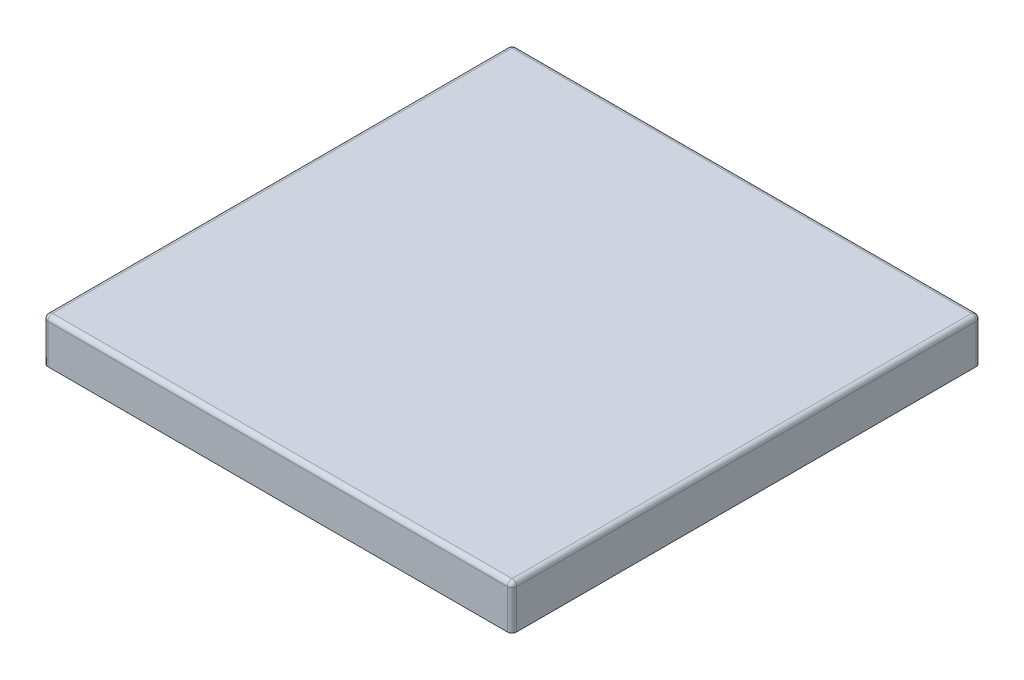
ISO-10303-21;
HEADER;
FILE_DESCRIPTION(('STEP AP214'),'2;1');
FILE_NAME('part.step','',(''),(''),'','','');
FILE_SCHEMA(('AUTOMOTIVE_DESIGN { 1 0 10303 214 1 1 1 1 }'));
ENDSEC;
DATA;
#1=APPLICATION_CONTEXT('core data for automotive mechanical design processes');
#2=APPLICATION_PROTOCOL_DEFINITION('international standard','automotive_design',2000,#1);
#3=PRODUCT_CONTEXT('',#1,'mechanical');
#4=PRODUCT('Part','Part','',(#3));
#5=PRODUCT_RELATED_PRODUCT_CATEGORY('part','',(#4));
#6=PRODUCT_DEFINITION_FORMATION('','',#4);
#7=PRODUCT_DEFINITION_CONTEXT('part definition',#1,'design');
#8=PRODUCT_DEFINITION('design','',#6,#7);
#9=PRODUCT_DEFINITION_SHAPE('','',#8);
#10=(LENGTH_UNIT() NAMED_UNIT(*) SI_UNIT(.MILLI.,.METRE.));
#11=(NAMED_UNIT(*) PLANE_ANGLE_UNIT() SI_UNIT($,.RADIAN.));
#12=(NAMED_UNIT(*) SI_UNIT($,.STERADIAN.) SOLID_ANGLE_UNIT());
#13=UNCERTAINTY_MEASURE_WITH_UNIT(LENGTH_MEASURE(1.E-05),#10,'distance_accuracy_value','');
#14=(GEOMETRIC_REPRESENTATION_CONTEXT(3) GLOBAL_UNCERTAINTY_ASSIGNED_CONTEXT((#13)) GLOBAL_UNIT_ASSIGNED_CONTEXT((#10,
#11,#12)) REPRESENTATION_CONTEXT('',''));
#15=CARTESIAN_POINT('',(0.,0.,0.));
#16=DIRECTION('',(0.,0.,1.));
#17=DIRECTION('',(1.,0.,0.));
#18=AXIS2_PLACEMENT_3D('',#15,#16,#17);
#19=CARTESIAN_POINT('',(-50.8,9.525,50.8));
#20=DIRECTION('',(1.,0.,0.));
#21=DIRECTION('',(0.,0.,-1.));
#22=AXIS2_PLACEMENT_3D('',#19,#20,#21);
#23=PLANE('',#22);
#24=DIRECTION('',(0.,0.,1.));
#25=VECTOR('',#24,1.);
#26=CARTESIAN_POINT('',(-50.8,0.,50.8));
#27=LINE('',#26,#25);
#28=CARTESIAN_POINT('',(-50.8,0.,-49.8));
#29=VERTEX_POINT('',#28);
#30=CARTESIAN_POINT('',(-50.8,0.,49.8));
#31=VERTEX_POINT('',#30);
#32=EDGE_CURVE('E223',#29,#31,#27,.T.);
#33=ORIENTED_EDGE('',*,*,#32,.T.);
#34=DIRECTION('',(0.,-1.,0.));
#35=VECTOR('',#34,1.);
#36=CARTESIAN_POINT('',(-50.8,9.525,49.8));
#37=LINE('',#36,#35);
#38=CARTESIAN_POINT('',(-50.8,8.525,49.8));
#39=VERTEX_POINT('',#38);
#40=EDGE_CURVE('E259',#31,#39,#37,.F.);
#41=ORIENTED_EDGE('',*,*,#40,.T.);
#42=DIRECTION('',(0.,0.,1.));
#43=VECTOR('',#42,1.);
#44=CARTESIAN_POINT('',(-50.8,8.525,-50.8));
#45=LINE('',#44,#43);
#46=CARTESIAN_POINT('',(-50.8,8.525,-49.8));
#47=VERTEX_POINT('',#46);
#48=EDGE_CURVE('E257',#39,#47,#45,.F.);
#49=ORIENTED_EDGE('',*,*,#48,.T.);
#50=DIRECTION('',(0.,-1.,0.));
#51=VECTOR('',#50,1.);
#52=CARTESIAN_POINT('',(-50.8,9.525,-49.8));
#53=LINE('',#52,#51);
#54=EDGE_CURVE('E255',#47,#29,#53,.T.);
#55=ORIENTED_EDGE('',*,*,#54,.T.);
#56=EDGE_LOOP('',(#33,#41,#49,#55));
#57=FACE_BOUND('',#56,.T.);
#58=ADVANCED_FACE('F49',(#57),#23,.F.);
#59=CARTESIAN_POINT('',(50.8,9.525,50.8));
#60=DIRECTION('',(0.,0.,-1.));
#61=DIRECTION('',(-1.,0.,0.));
#62=AXIS2_PLACEMENT_3D('',#59,#60,#61);
#63=PLANE('',#62);
#64=DIRECTION('',(1.,0.,0.));
#65=VECTOR('',#64,1.);
#66=CARTESIAN_POINT('',(50.8,0.,50.8));
#67=LINE('',#66,#65);
#68=CARTESIAN_POINT('',(-49.8,0.,50.8));
#69=VERTEX_POINT('',#68);
#70=CARTESIAN_POINT('',(49.8,0.,50.8));
#71=VERTEX_POINT('',#70);
#72=EDGE_CURVE('E226',#69,#71,#67,.T.);
#73=ORIENTED_EDGE('',*,*,#72,.T.);
#74=DIRECTION('',(0.,-1.,0.));
#75=VECTOR('',#74,1.);
#76=CARTESIAN_POINT('',(49.8,9.525,50.8));
#77=LINE('',#76,#75);
#78=CARTESIAN_POINT('',(49.8,8.525,50.8));
#79=VERTEX_POINT('',#78);
#80=EDGE_CURVE('E253',#71,#79,#77,.F.);
#81=ORIENTED_EDGE('',*,*,#80,.T.);
#82=DIRECTION('',(1.,0.,0.));
#83=VECTOR('',#82,1.);
#84=CARTESIAN_POINT('',(-50.8,8.525,50.8));
#85=LINE('',#84,#83);
#86=CARTESIAN_POINT('',(-49.8,8.525,50.8));
#87=VERTEX_POINT('',#86);
#88=EDGE_CURVE('E249',#79,#87,#85,.F.);
#89=ORIENTED_EDGE('',*,*,#88,.T.);
#90=DIRECTION('',(0.,-1.,0.));
#91=VECTOR('',#90,1.);
#92=CARTESIAN_POINT('',(-49.8,9.525,50.8));
#93=LINE('',#92,#91);
#94=EDGE_CURVE('E251',#87,#69,#93,.T.);
#95=ORIENTED_EDGE('',*,*,#94,.T.);
#96=EDGE_LOOP('',(#73,#81,#89,#95));
#97=FACE_BOUND('',#96,.T.);
#98=ADVANCED_FACE('F357',(#97),#63,.F.);
#99=CARTESIAN_POINT('',(50.8,9.525,50.8));
#100=DIRECTION('',(-1.,0.,0.));
#101=DIRECTION('',(0.,0.,1.));
#102=AXIS2_PLACEMENT_3D('',#99,#100,#101);
#103=PLANE('',#102);
#104=DIRECTION('',(0.,0.,-1.));
#105=VECTOR('',#104,1.);
#106=CARTESIAN_POINT('',(50.8,8.525,50.8));
#107=LINE('',#106,#105);
#108=CARTESIAN_POINT('',(50.8,8.525,-49.8));
#109=VERTEX_POINT('',#108);
#110=CARTESIAN_POINT('',(50.8,8.525,49.8));
#111=VERTEX_POINT('',#110);
#112=EDGE_CURVE('E234',#109,#111,#107,.F.);
#113=ORIENTED_EDGE('',*,*,#112,.T.);
#114=DIRECTION('',(0.,-1.,0.));
#115=VECTOR('',#114,1.);
#116=CARTESIAN_POINT('',(50.8,9.525,49.8));
#117=LINE('',#116,#115);
#118=CARTESIAN_POINT('',(50.8,0.,49.8));
#119=VERTEX_POINT('',#118);
#120=EDGE_CURVE('E238',#111,#119,#117,.T.);
#121=ORIENTED_EDGE('',*,*,#120,.T.);
#122=DIRECTION('',(0.,0.,-1.));
#123=VECTOR('',#122,1.);
#124=CARTESIAN_POINT('',(50.8,0.,50.8));
#125=LINE('',#124,#123);
#126=CARTESIAN_POINT('',(50.8,0.,-49.8));
#127=VERTEX_POINT('',#126);
#128=EDGE_CURVE('E229',#119,#127,#125,.T.);
#129=ORIENTED_EDGE('',*,*,#128,.T.);
#130=DIRECTION('',(0.,-1.,0.));
#131=VECTOR('',#130,1.);
#132=CARTESIAN_POINT('',(50.8,9.525,-49.8));
#133=LINE('',#132,#131);
#134=EDGE_CURVE('E236',#127,#109,#133,.F.);
#135=ORIENTED_EDGE('',*,*,#134,.T.);
#136=EDGE_LOOP('',(#113,#121,#129,#135));
#137=FACE_BOUND('',#136,.T.);
#138=ADVANCED_FACE('F349',(#137),#103,.F.);
#139=CARTESIAN_POINT('',(50.8,9.525,-50.8));
#140=DIRECTION('',(0.,0.,1.));
#141=DIRECTION('',(1.,0.,0.));
#142=AXIS2_PLACEMENT_3D('',#139,#140,#141);
#143=PLANE('',#142);
#144=DIRECTION('',(-1.,0.,0.));
#145=VECTOR('',#144,1.);
#146=CARTESIAN_POINT('',(50.8,0.,-50.8));
#147=LINE('',#146,#145);
#148=CARTESIAN_POINT('',(49.8,0.,-50.8));
#149=VERTEX_POINT('',#148);
#150=CARTESIAN_POINT('',(-49.8,0.,-50.8));
#151=VERTEX_POINT('',#150);
#152=EDGE_CURVE('E232',#149,#151,#147,.T.);
#153=ORIENTED_EDGE('',*,*,#152,.T.);
#154=DIRECTION('',(0.,-1.,0.));
#155=VECTOR('',#154,1.);
#156=CARTESIAN_POINT('',(-49.8,9.525,-50.8));
#157=LINE('',#156,#155);
#158=CARTESIAN_POINT('',(-49.8,8.525,-50.8));
#159=VERTEX_POINT('',#158);
#160=EDGE_CURVE('E13',#151,#159,#157,.F.);
#161=ORIENTED_EDGE('',*,*,#160,.T.);
#162=DIRECTION('',(-1.,0.,0.));
#163=VECTOR('',#162,1.);
#164=CARTESIAN_POINT('',(50.8,8.525,-50.8));
#165=LINE('',#164,#163);
#166=CARTESIAN_POINT('',(49.8,8.525,-50.8));
#167=VERTEX_POINT('',#166);
#168=EDGE_CURVE('E65',#159,#167,#165,.F.);
#169=ORIENTED_EDGE('',*,*,#168,.T.);
#170=DIRECTION('',(0.,-1.,0.));
#171=VECTOR('',#170,1.);
#172=CARTESIAN_POINT('',(49.8,9.525,-50.8));
#173=LINE('',#172,#171);
#174=EDGE_CURVE('E58',#167,#149,#173,.T.);
#175=ORIENTED_EDGE('',*,*,#174,.T.);
#176=EDGE_LOOP('',(#153,#161,#169,#175));
#177=FACE_BOUND('',#176,.T.);
#178=ADVANCED_FACE('F347',(#177),#143,.F.);
#179=CARTESIAN_POINT('',(0.,9.525,0.));
#180=DIRECTION('',(0.,1.,0.));
#181=DIRECTION('',(0.,0.,1.));
#182=AXIS2_PLACEMENT_3D('',#179,#180,#181);
#183=PLANE('',#182);
#184=DIRECTION('',(-1.,0.,0.));
#185=VECTOR('',#184,1.);
#186=CARTESIAN_POINT('',(-50.8,9.525,-49.8));
#187=LINE('',#186,#185);
#188=CARTESIAN_POINT('',(49.8,9.525,-49.8));
#189=VERTEX_POINT('',#188);
#190=CARTESIAN_POINT('',(-49.8,9.525,-49.8));
#191=VERTEX_POINT('',#190);
#192=EDGE_CURVE('E263',#189,#191,#187,.T.);
#193=ORIENTED_EDGE('',*,*,#192,.T.);
#194=DIRECTION('',(0.,0.,1.));
#195=VECTOR('',#194,1.);
#196=CARTESIAN_POINT('',(-49.8,9.525,50.8));
#197=LINE('',#196,#195);
#198=CARTESIAN_POINT('',(-49.8,9.525,49.8));
#199=VERTEX_POINT('',#198);
#200=EDGE_CURVE('E267',#191,#199,#197,.T.);
#201=ORIENTED_EDGE('',*,*,#200,.T.);
#202=DIRECTION('',(1.,0.,0.));
#203=VECTOR('',#202,1.);
#204=CARTESIAN_POINT('',(50.8,9.525,49.8));
#205=LINE('',#204,#203);
#206=CARTESIAN_POINT('',(49.8,9.525,49.8));
#207=VERTEX_POINT('',#206);
#208=EDGE_CURVE('E265',#199,#207,#205,.T.);
#209=ORIENTED_EDGE('',*,*,#208,.T.);
#210=DIRECTION('',(0.,0.,-1.));
#211=VECTOR('',#210,1.);
#212=CARTESIAN_POINT('',(49.8,9.525,-50.8));
#213=LINE('',#212,#211);
#214=EDGE_CURVE('E261',#207,#189,#213,.T.);
#215=ORIENTED_EDGE('',*,*,#214,.T.);
#216=EDGE_LOOP('',(#193,#201,#209,#215));
#217=FACE_BOUND('',#216,.T.);
#218=ADVANCED_FACE('F332',(#217),#183,.T.);
#219=CARTESIAN_POINT('',(0.,0.,0.));
#220=DIRECTION('',(0.,1.,0.));
#221=DIRECTION('',(0.,0.,1.));
#222=AXIS2_PLACEMENT_3D('',#219,#220,#221);
#223=PLANE('',#222);
#224=CARTESIAN_POINT('',(0.,0.,42.865));
#225=DIRECTION('',(0.,-1.,0.));
#226=DIRECTION('',(0.,0.,-1.));
#227=AXIS2_PLACEMENT_3D('',#224,#225,#226);
#228=CIRCLE('',#227,2.5527);
#229=CARTESIAN_POINT('',(0.,0.,40.3123));
#230=VERTEX_POINT('',#229);
#231=EDGE_CURVE('E165',#230,#230,#228,.T.);
#232=ORIENTED_EDGE('',*,*,#231,.F.);
#233=EDGE_LOOP('',(#232));
#234=FACE_BOUND('',#233,.T.);
#235=CARTESIAN_POINT('',(0.,0.,-42.865));
#236=DIRECTION('',(0.,-1.,0.));
#237=DIRECTION('',(0.,0.,-1.));
#238=AXIS2_PLACEMENT_3D('',#235,#236,#237);
#239=CIRCLE('',#238,2.5527);
#240=CARTESIAN_POINT('',(0.,0.,-45.4177));
#241=VERTEX_POINT('',#240);
#242=EDGE_CURVE('E164',#241,#241,#239,.T.);
#243=ORIENTED_EDGE('',*,*,#242,.F.);
#244=EDGE_LOOP('',(#243));
#245=FACE_BOUND('',#244,.T.);
#246=CARTESIAN_POINT('',(44.45,0.,44.45));
#247=DIRECTION('',(0.,-1.,0.));
#248=DIRECTION('',(0.,0.,-1.));
#249=AXIS2_PLACEMENT_3D('',#246,#247,#248);
#250=CIRCLE('',#249,1.35255);
#251=CARTESIAN_POINT('',(44.45,0.,43.09745));
#252=VERTEX_POINT('',#251);
#253=EDGE_CURVE('E175',#252,#252,#250,.T.);
#254=ORIENTED_EDGE('',*,*,#253,.F.);
#255=EDGE_LOOP('',(#254));
#256=FACE_BOUND('',#255,.T.);
#257=CARTESIAN_POINT('',(44.45,0.,-44.45));
#258=DIRECTION('',(0.,-1.,0.));
#259=DIRECTION('',(0.,0.,-1.));
#260=AXIS2_PLACEMENT_3D('',#257,#258,#259);
#261=CIRCLE('',#260,1.35255);
#262=CARTESIAN_POINT('',(44.45,0.,-45.80255));
#263=VERTEX_POINT('',#262);
#264=EDGE_CURVE('E181',#263,#263,#261,.T.);
#265=ORIENTED_EDGE('',*,*,#264,.F.);
#266=EDGE_LOOP('',(#265));
#267=FACE_BOUND('',#266,.T.);
#268=CARTESIAN_POINT('',(-44.45,0.,-44.45));
#269=DIRECTION('',(0.,-1.,0.));
#270=DIRECTION('',(0.,0.,-1.));
#271=AXIS2_PLACEMENT_3D('',#268,#269,#270);
#272=CIRCLE('',#271,1.35255);
#273=CARTESIAN_POINT('',(-44.45,0.,-45.80255));
#274=VERTEX_POINT('',#273);
#275=EDGE_CURVE('E187',#274,#274,#272,.T.);
#276=ORIENTED_EDGE('',*,*,#275,.F.);
#277=EDGE_LOOP('',(#276));
#278=FACE_BOUND('',#277,.T.);
#279=CARTESIAN_POINT('',(-44.45,0.,44.45));
#280=DIRECTION('',(0.,-1.,0.));
#281=DIRECTION('',(0.,0.,-1.));
#282=AXIS2_PLACEMENT_3D('',#279,#280,#281);
#283=CIRCLE('',#282,1.35255);
#284=CARTESIAN_POINT('',(-44.45,0.,43.09745));
#285=VERTEX_POINT('',#284);
#286=EDGE_CURVE('E193',#285,#285,#283,.T.);
#287=ORIENTED_EDGE('',*,*,#286,.F.);
#288=EDGE_LOOP('',(#287));
#289=FACE_BOUND('',#288,.T.);
#290=CARTESIAN_POINT('',(44.45,0.,28.575));
#291=DIRECTION('',(0.,-1.,0.));
#292=DIRECTION('',(0.,0.,-1.));
#293=AXIS2_PLACEMENT_3D('',#290,#291,#292);
#294=CIRCLE('',#293,1.35255);
#295=CARTESIAN_POINT('',(44.45,0.,27.22245));
#296=VERTEX_POINT('',#295);
#297=EDGE_CURVE('E199',#296,#296,#294,.T.);
#298=ORIENTED_EDGE('',*,*,#297,.F.);
#299=EDGE_LOOP('',(#298));
#300=FACE_BOUND('',#299,.T.);
#301=CARTESIAN_POINT('',(44.45,0.,-28.575));
#302=DIRECTION('',(0.,-1.,0.));
#303=DIRECTION('',(0.,0.,-1.));
#304=AXIS2_PLACEMENT_3D('',#301,#302,#303);
#305=CIRCLE('',#304,1.35255);
#306=CARTESIAN_POINT('',(44.45,0.,-29.92755));
#307=VERTEX_POINT('',#306);
#308=EDGE_CURVE('E205',#307,#307,#305,.T.);
#309=ORIENTED_EDGE('',*,*,#308,.F.);
#310=EDGE_LOOP('',(#309));
#311=FACE_BOUND('',#310,.T.);
#312=CARTESIAN_POINT('',(-44.45,0.,-28.575));
#313=DIRECTION('',(0.,-1.,0.));
#314=DIRECTION('',(0.,0.,-1.));
#315=AXIS2_PLACEMENT_3D('',#312,#313,#314);
#316=CIRCLE('',#315,1.35255);
#317=CARTESIAN_POINT('',(-44.45,0.,-29.92755));
#318=VERTEX_POINT('',#317);
#319=EDGE_CURVE('E211',#318,#318,#316,.T.);
#320=ORIENTED_EDGE('',*,*,#319,.F.);
#321=EDGE_LOOP('',(#320));
#322=FACE_BOUND('',#321,.T.);
#323=CARTESIAN_POINT('',(-44.45,0.,28.575));
#324=DIRECTION('',(0.,-1.,0.));
#325=DIRECTION('',(0.,0.,-1.));
#326=AXIS2_PLACEMENT_3D('',#323,#324,#325);
#327=CIRCLE('',#326,1.35255);
#328=CARTESIAN_POINT('',(-44.45,0.,27.22245));
#329=VERTEX_POINT('',#328);
#330=EDGE_CURVE('E217',#329,#329,#327,.T.);
#331=ORIENTED_EDGE('',*,*,#330,.F.);
#332=EDGE_LOOP('',(#331));
#333=FACE_BOUND('',#332,.T.);
#334=ORIENTED_EDGE('',*,*,#128,.F.);
#335=CARTESIAN_POINT('',(49.8,0.,49.8));
#336=DIRECTION('',(0.,1.,0.));
#337=DIRECTION('',(0.,0.,1.));
#338=AXIS2_PLACEMENT_3D('',#335,#336,#337);
#339=CIRCLE('',#338,1.);
#340=EDGE_CURVE('E247',#119,#71,#339,.F.);
#341=ORIENTED_EDGE('',*,*,#340,.T.);
#342=ORIENTED_EDGE('',*,*,#72,.F.);
#343=CARTESIAN_POINT('',(-49.8,0.,49.8));
#344=DIRECTION('',(0.,1.,0.));
#345=DIRECTION('',(0.,0.,1.));
#346=AXIS2_PLACEMENT_3D('',#343,#344,#345);
#347=CIRCLE('',#346,1.);
#348=EDGE_CURVE('E245',#69,#31,#347,.F.);
#349=ORIENTED_EDGE('',*,*,#348,.T.);
#350=ORIENTED_EDGE('',*,*,#32,.F.);
#351=CARTESIAN_POINT('',(-49.8,0.,-49.8));
#352=DIRECTION('',(0.,1.,0.));
#353=DIRECTION('',(0.,0.,1.));
#354=AXIS2_PLACEMENT_3D('',#351,#352,#353);
#355=CIRCLE('',#354,1.);
#356=EDGE_CURVE('E243',#29,#151,#355,.F.);
#357=ORIENTED_EDGE('',*,*,#356,.T.);
#358=ORIENTED_EDGE('',*,*,#152,.F.);
#359=CARTESIAN_POINT('',(49.8,0.,-49.8));
#360=DIRECTION('',(0.,1.,0.));
#361=DIRECTION('',(0.,0.,1.));
#362=AXIS2_PLACEMENT_3D('',#359,#360,#361);
#363=CIRCLE('',#362,1.);
#364=EDGE_CURVE('E241',#149,#127,#363,.F.);
#365=ORIENTED_EDGE('',*,*,#364,.T.);
#366=EDGE_LOOP('',(#334,#341,#342,#349,#350,#357,#358,#365));
#367=FACE_BOUND('',#366,.T.);
#368=ADVANCED_FACE('F319',(#234,#245,#256,#267,#278,#289,#300,#311,#322,#333,#367),#223,.F.);
#369=CARTESIAN_POINT('',(-44.45,6.18730596973427,28.575));
#370=DIRECTION('',(0.,-1.,0.));
#371=DIRECTION('',(0.,0.,-1.));
#372=AXIS2_PLACEMENT_3D('',#369,#370,#371);
#373=CONICAL_SURFACE('',#372,1.35255,1.02974425867665);
#374=CARTESIAN_POINT('',(-44.45,7.,28.575));
#375=VERTEX_POINT('',#374);
#376=VERTEX_LOOP('',#375);
#377=FACE_BOUND('',#376,.T.);
#378=CARTESIAN_POINT('',(-44.45,6.18730596973427,28.575));
#379=DIRECTION('',(0.,-1.,0.));
#380=DIRECTION('',(0.,0.,-1.));
#381=AXIS2_PLACEMENT_3D('',#378,#379,#380);
#382=CIRCLE('',#381,1.35255);
#383=CARTESIAN_POINT('',(-44.45,6.18730596973427,27.22245));
#384=VERTEX_POINT('',#383);
#385=EDGE_CURVE('E220',#384,#384,#382,.T.);
#386=ORIENTED_EDGE('',*,*,#385,.T.);
#387=EDGE_LOOP('',(#386));
#388=FACE_BOUND('',#387,.T.);
#389=ADVANCED_FACE('F473',(#377,#388),#373,.F.);
#390=CARTESIAN_POINT('',(-44.45,0.,28.575));
#391=DIRECTION('',(0.,-1.,0.));
#392=DIRECTION('',(0.,0.,-1.));
#393=AXIS2_PLACEMENT_3D('',#390,#391,#392);
#394=CYLINDRICAL_SURFACE('',#393,1.35255);
#395=ORIENTED_EDGE('',*,*,#385,.F.);
#396=EDGE_LOOP('',(#395));
#397=FACE_BOUND('',#396,.T.);
#398=ORIENTED_EDGE('',*,*,#330,.T.);
#399=EDGE_LOOP('',(#398));
#400=FACE_BOUND('',#399,.T.);
#401=ADVANCED_FACE('F682',(#397,#400),#394,.F.);
#402=CARTESIAN_POINT('',(-44.45,6.18730596973427,-28.575));
#403=DIRECTION('',(0.,-1.,0.));
#404=DIRECTION('',(0.,0.,-1.));
#405=AXIS2_PLACEMENT_3D('',#402,#403,#404);
#406=CONICAL_SURFACE('',#405,1.35255,1.02974425867665);
#407=CARTESIAN_POINT('',(-44.45,7.,-28.575));
#408=VERTEX_POINT('',#407);
#409=VERTEX_LOOP('',#408);
#410=FACE_BOUND('',#409,.T.);
#411=CARTESIAN_POINT('',(-44.45,6.18730596973427,-28.575));
#412=DIRECTION('',(0.,-1.,0.));
#413=DIRECTION('',(0.,0.,-1.));
#414=AXIS2_PLACEMENT_3D('',#411,#412,#413);
#415=CIRCLE('',#414,1.35255);
#416=CARTESIAN_POINT('',(-44.45,6.18730596973427,-29.92755));
#417=VERTEX_POINT('',#416);
#418=EDGE_CURVE('E214',#417,#417,#415,.T.);
#419=ORIENTED_EDGE('',*,*,#418,.T.);
#420=EDGE_LOOP('',(#419));
#421=FACE_BOUND('',#420,.T.);
#422=ADVANCED_FACE('F672',(#410,#421),#406,.F.);
#423=CARTESIAN_POINT('',(-44.45,0.,-28.575));
#424=DIRECTION('',(0.,-1.,0.));
#425=DIRECTION('',(0.,0.,-1.));
#426=AXIS2_PLACEMENT_3D('',#423,#424,#425);
#427=CYLINDRICAL_SURFACE('',#426,1.35255);
#428=ORIENTED_EDGE('',*,*,#418,.F.);
#429=EDGE_LOOP('',(#428));
#430=FACE_BOUND('',#429,.T.);
#431=ORIENTED_EDGE('',*,*,#319,.T.);
#432=EDGE_LOOP('',(#431));
#433=FACE_BOUND('',#432,.T.);
#434=ADVANCED_FACE('F662',(#430,#433),#427,.F.);
#435=CARTESIAN_POINT('',(44.45,6.18730596973427,-28.575));
#436=DIRECTION('',(0.,-1.,0.));
#437=DIRECTION('',(0.,0.,-1.));
#438=AXIS2_PLACEMENT_3D('',#435,#436,#437);
#439=CONICAL_SURFACE('',#438,1.35255,1.02974425867665);
#440=CARTESIAN_POINT('',(44.45,7.,-28.575));
#441=VERTEX_POINT('',#440);
#442=VERTEX_LOOP('',#441);
#443=FACE_BOUND('',#442,.T.);
#444=CARTESIAN_POINT('',(44.45,6.18730596973427,-28.575));
#445=DIRECTION('',(0.,-1.,0.));
#446=DIRECTION('',(0.,0.,-1.));
#447=AXIS2_PLACEMENT_3D('',#444,#445,#446);
#448=CIRCLE('',#447,1.35255);
#449=CARTESIAN_POINT('',(44.45,6.18730596973427,-29.92755));
#450=VERTEX_POINT('',#449);
#451=EDGE_CURVE('E208',#450,#450,#448,.T.);
#452=ORIENTED_EDGE('',*,*,#451,.T.);
#453=EDGE_LOOP('',(#452));
#454=FACE_BOUND('',#453,.T.);
#455=ADVANCED_FACE('F652',(#443,#454),#439,.F.);
#456=CARTESIAN_POINT('',(44.45,0.,-28.575));
#457=DIRECTION('',(0.,-1.,0.));
#458=DIRECTION('',(0.,0.,-1.));
#459=AXIS2_PLACEMENT_3D('',#456,#457,#458);
#460=CYLINDRICAL_SURFACE('',#459,1.35255);
#461=ORIENTED_EDGE('',*,*,#451,.F.);
#462=EDGE_LOOP('',(#461));
#463=FACE_BOUND('',#462,.T.);
#464=ORIENTED_EDGE('',*,*,#308,.T.);
#465=EDGE_LOOP('',(#464));
#466=FACE_BOUND('',#465,.T.);
#467=ADVANCED_FACE('F642',(#463,#466),#460,.F.);
#468=CARTESIAN_POINT('',(44.45,6.18730596973427,28.575));
#469=DIRECTION('',(0.,-1.,0.));
#470=DIRECTION('',(0.,0.,-1.));
#471=AXIS2_PLACEMENT_3D('',#468,#469,#470);
#472=CONICAL_SURFACE('',#471,1.35255,1.02974425867665);
#473=CARTESIAN_POINT('',(44.45,7.,28.575));
#474=VERTEX_POINT('',#473);
#475=VERTEX_LOOP('',#474);
#476=FACE_BOUND('',#475,.T.);
#477=CARTESIAN_POINT('',(44.45,6.18730596973427,28.575));
#478=DIRECTION('',(0.,-1.,0.));
#479=DIRECTION('',(0.,0.,-1.));
#480=AXIS2_PLACEMENT_3D('',#477,#478,#479);
#481=CIRCLE('',#480,1.35255);
#482=CARTESIAN_POINT('',(44.45,6.18730596973427,27.22245));
#483=VERTEX_POINT('',#482);
#484=EDGE_CURVE('E202',#483,#483,#481,.T.);
#485=ORIENTED_EDGE('',*,*,#484,.T.);
#486=EDGE_LOOP('',(#485));
#487=FACE_BOUND('',#486,.T.);
#488=ADVANCED_FACE('F632',(#476,#487),#472,.F.);
#489=CARTESIAN_POINT('',(44.45,0.,28.575));
#490=DIRECTION('',(0.,-1.,0.));
#491=DIRECTION('',(0.,0.,-1.));
#492=AXIS2_PLACEMENT_3D('',#489,#490,#491);
#493=CYLINDRICAL_SURFACE('',#492,1.35255);
#494=ORIENTED_EDGE('',*,*,#484,.F.);
#495=EDGE_LOOP('',(#494));
#496=FACE_BOUND('',#495,.T.);
#497=ORIENTED_EDGE('',*,*,#297,.T.);
#498=EDGE_LOOP('',(#497));
#499=FACE_BOUND('',#498,.T.);
#500=ADVANCED_FACE('F622',(#496,#499),#493,.F.);
#501=CARTESIAN_POINT('',(-44.45,6.18730596973427,44.45));
#502=DIRECTION('',(0.,-1.,0.));
#503=DIRECTION('',(0.,0.,-1.));
#504=AXIS2_PLACEMENT_3D('',#501,#502,#503);
#505=CONICAL_SURFACE('',#504,1.35255,1.02974425867665);
#506=CARTESIAN_POINT('',(-44.45,7.,44.45));
#507=VERTEX_POINT('',#506);
#508=VERTEX_LOOP('',#507);
#509=FACE_BOUND('',#508,.T.);
#510=CARTESIAN_POINT('',(-44.45,6.18730596973427,44.45));
#511=DIRECTION('',(0.,-1.,0.));
#512=DIRECTION('',(0.,0.,-1.));
#513=AXIS2_PLACEMENT_3D('',#510,#511,#512);
#514=CIRCLE('',#513,1.35255);
#515=CARTESIAN_POINT('',(-44.45,6.18730596973427,43.09745));
#516=VERTEX_POINT('',#515);
#517=EDGE_CURVE('E196',#516,#516,#514,.T.);
#518=ORIENTED_EDGE('',*,*,#517,.T.);
#519=EDGE_LOOP('',(#518));
#520=FACE_BOUND('',#519,.T.);
#521=ADVANCED_FACE('F611',(#509,#520),#505,.F.);
#522=CARTESIAN_POINT('',(-44.45,0.,44.45));
#523=DIRECTION('',(0.,-1.,0.));
#524=DIRECTION('',(0.,0.,-1.));
#525=AXIS2_PLACEMENT_3D('',#522,#523,#524);
#526=CYLINDRICAL_SURFACE('',#525,1.35255);
#527=ORIENTED_EDGE('',*,*,#517,.F.);
#528=EDGE_LOOP('',(#527));
#529=FACE_BOUND('',#528,.T.);
#530=ORIENTED_EDGE('',*,*,#286,.T.);
#531=EDGE_LOOP('',(#530));
#532=FACE_BOUND('',#531,.T.);
#533=ADVANCED_FACE('F601',(#529,#532),#526,.F.);
#534=CARTESIAN_POINT('',(-44.45,6.18730596973427,-44.45));
#535=DIRECTION('',(0.,-1.,0.));
#536=DIRECTION('',(0.,0.,-1.));
#537=AXIS2_PLACEMENT_3D('',#534,#535,#536);
#538=CONICAL_SURFACE('',#537,1.35255,1.02974425867665);
#539=CARTESIAN_POINT('',(-44.45,7.,-44.45));
#540=VERTEX_POINT('',#539);
#541=VERTEX_LOOP('',#540);
#542=FACE_BOUND('',#541,.T.);
#543=CARTESIAN_POINT('',(-44.45,6.18730596973427,-44.45));
#544=DIRECTION('',(0.,-1.,0.));
#545=DIRECTION('',(0.,0.,-1.));
#546=AXIS2_PLACEMENT_3D('',#543,#544,#545);
#547=CIRCLE('',#546,1.35255);
#548=CARTESIAN_POINT('',(-44.45,6.18730596973427,-45.80255));
#549=VERTEX_POINT('',#548);
#550=EDGE_CURVE('E190',#549,#549,#547,.T.);
#551=ORIENTED_EDGE('',*,*,#550,.T.);
#552=EDGE_LOOP('',(#551));
#553=FACE_BOUND('',#552,.T.);
#554=ADVANCED_FACE('F591',(#542,#553),#538,.F.);
#555=CARTESIAN_POINT('',(-44.45,0.,-44.45));
#556=DIRECTION('',(0.,-1.,0.));
#557=DIRECTION('',(0.,0.,-1.));
#558=AXIS2_PLACEMENT_3D('',#555,#556,#557);
#559=CYLINDRICAL_SURFACE('',#558,1.35255);
#560=ORIENTED_EDGE('',*,*,#550,.F.);
#561=EDGE_LOOP('',(#560));
#562=FACE_BOUND('',#561,.T.);
#563=ORIENTED_EDGE('',*,*,#275,.T.);
#564=EDGE_LOOP('',(#563));
#565=FACE_BOUND('',#564,.T.);
#566=ADVANCED_FACE('F581',(#562,#565),#559,.F.);
#567=CARTESIAN_POINT('',(44.45,6.18730596973427,-44.45));
#568=DIRECTION('',(0.,-1.,0.));
#569=DIRECTION('',(0.,0.,-1.));
#570=AXIS2_PLACEMENT_3D('',#567,#568,#569);
#571=CONICAL_SURFACE('',#570,1.35255,1.02974425867665);
#572=CARTESIAN_POINT('',(44.45,7.,-44.45));
#573=VERTEX_POINT('',#572);
#574=VERTEX_LOOP('',#573);
#575=FACE_BOUND('',#574,.T.);
#576=CARTESIAN_POINT('',(44.45,6.18730596973427,-44.45));
#577=DIRECTION('',(0.,-1.,0.));
#578=DIRECTION('',(0.,0.,-1.));
#579=AXIS2_PLACEMENT_3D('',#576,#577,#578);
#580=CIRCLE('',#579,1.35255);
#581=CARTESIAN_POINT('',(44.45,6.18730596973427,-45.80255));
#582=VERTEX_POINT('',#581);
#583=EDGE_CURVE('E184',#582,#582,#580,.T.);
#584=ORIENTED_EDGE('',*,*,#583,.T.);
#585=EDGE_LOOP('',(#584));
#586=FACE_BOUND('',#585,.T.);
#587=ADVANCED_FACE('F571',(#575,#586),#571,.F.);
#588=CARTESIAN_POINT('',(44.45,0.,-44.45));
#589=DIRECTION('',(0.,-1.,0.));
#590=DIRECTION('',(0.,0.,-1.));
#591=AXIS2_PLACEMENT_3D('',#588,#589,#590);
#592=CYLINDRICAL_SURFACE('',#591,1.35255);
#593=ORIENTED_EDGE('',*,*,#583,.F.);
#594=EDGE_LOOP('',(#593));
#595=FACE_BOUND('',#594,.T.);
#596=ORIENTED_EDGE('',*,*,#264,.T.);
#597=EDGE_LOOP('',(#596));
#598=FACE_BOUND('',#597,.T.);
#599=ADVANCED_FACE('F561',(#595,#598),#592,.F.);
#600=CARTESIAN_POINT('',(44.45,6.18730596973427,44.45));
#601=DIRECTION('',(0.,-1.,0.));
#602=DIRECTION('',(0.,0.,-1.));
#603=AXIS2_PLACEMENT_3D('',#600,#601,#602);
#604=CONICAL_SURFACE('',#603,1.35255,1.02974425867665);
#605=CARTESIAN_POINT('',(44.45,7.,44.45));
#606=VERTEX_POINT('',#605);
#607=VERTEX_LOOP('',#606);
#608=FACE_BOUND('',#607,.T.);
#609=CARTESIAN_POINT('',(44.45,6.18730596973427,44.45));
#610=DIRECTION('',(0.,-1.,0.));
#611=DIRECTION('',(0.,0.,-1.));
#612=AXIS2_PLACEMENT_3D('',#609,#610,#611);
#613=CIRCLE('',#612,1.35255);
#614=CARTESIAN_POINT('',(44.45,6.18730596973427,43.09745));
#615=VERTEX_POINT('',#614);
#616=EDGE_CURVE('E178',#615,#615,#613,.T.);
#617=ORIENTED_EDGE('',*,*,#616,.T.);
#618=EDGE_LOOP('',(#617));
#619=FACE_BOUND('',#618,.T.);
#620=ADVANCED_FACE('F551',(#608,#619),#604,.F.);
#621=CARTESIAN_POINT('',(44.45,0.,44.45));
#622=DIRECTION('',(0.,-1.,0.));
#623=DIRECTION('',(0.,0.,-1.));
#624=AXIS2_PLACEMENT_3D('',#621,#622,#623);
#625=CYLINDRICAL_SURFACE('',#624,1.35255);
#626=ORIENTED_EDGE('',*,*,#616,.F.);
#627=EDGE_LOOP('',(#626));
#628=FACE_BOUND('',#627,.T.);
#629=ORIENTED_EDGE('',*,*,#253,.T.);
#630=EDGE_LOOP('',(#629));
#631=FACE_BOUND('',#630,.T.);
#632=ADVANCED_FACE('F541',(#628,#631),#625,.F.);
#633=CARTESIAN_POINT('',(0.,5.46618309780835,-42.865));
#634=DIRECTION('',(0.,-1.,0.));
#635=DIRECTION('',(0.,0.,-1.));
#636=AXIS2_PLACEMENT_3D('',#633,#634,#635);
#637=CONICAL_SURFACE('',#636,2.5527,1.02974425867665);
#638=CARTESIAN_POINT('',(0.,7.,-42.865));
#639=VERTEX_POINT('',#638);
#640=VERTEX_LOOP('',#639);
#641=FACE_BOUND('',#640,.T.);
#642=CARTESIAN_POINT('',(0.,5.46618309780835,-42.865));
#643=DIRECTION('',(0.,-1.,0.));
#644=DIRECTION('',(0.,0.,-1.));
#645=AXIS2_PLACEMENT_3D('',#642,#643,#644);
#646=CIRCLE('',#645,2.5527);
#647=CARTESIAN_POINT('',(0.,5.46618309780835,-45.4177));
#648=VERTEX_POINT('',#647);
#649=EDGE_CURVE('E168',#648,#648,#646,.T.);
#650=ORIENTED_EDGE('',*,*,#649,.T.);
#651=EDGE_LOOP('',(#650));
#652=FACE_BOUND('',#651,.T.);
#653=ADVANCED_FACE('F531',(#641,#652),#637,.F.);
#654=CARTESIAN_POINT('',(0.,0.,-42.865));
#655=DIRECTION('',(0.,-1.,0.));
#656=DIRECTION('',(0.,0.,-1.));
#657=AXIS2_PLACEMENT_3D('',#654,#655,#656);
#658=CYLINDRICAL_SURFACE('',#657,2.5527);
#659=ORIENTED_EDGE('',*,*,#649,.F.);
#660=EDGE_LOOP('',(#659));
#661=FACE_BOUND('',#660,.T.);
#662=ORIENTED_EDGE('',*,*,#242,.T.);
#663=EDGE_LOOP('',(#662));
#664=FACE_BOUND('',#663,.T.);
#665=ADVANCED_FACE('F158',(#661,#664),#658,.F.);
#666=CARTESIAN_POINT('',(0.,5.46618309780835,42.865));
#667=DIRECTION('',(0.,-1.,0.));
#668=DIRECTION('',(0.,0.,-1.));
#669=AXIS2_PLACEMENT_3D('',#666,#667,#668);
#670=CONICAL_SURFACE('',#669,2.5527,1.02974425867665);
#671=CARTESIAN_POINT('',(0.,7.,42.865));
#672=VERTEX_POINT('',#671);
#673=VERTEX_LOOP('',#672);
#674=FACE_BOUND('',#673,.T.);
#675=CARTESIAN_POINT('',(0.,5.46618309780835,42.865));
#676=DIRECTION('',(0.,-1.,0.));
#677=DIRECTION('',(0.,0.,-1.));
#678=AXIS2_PLACEMENT_3D('',#675,#676,#677);
#679=CIRCLE('',#678,2.5527);
#680=CARTESIAN_POINT('',(0.,5.46618309780835,40.3123));
#681=VERTEX_POINT('',#680);
#682=EDGE_CURVE('E162',#681,#681,#679,.T.);
#683=ORIENTED_EDGE('',*,*,#682,.T.);
#684=EDGE_LOOP('',(#683));
#685=FACE_BOUND('',#684,.T.);
#686=ADVANCED_FACE('F154',(#674,#685),#670,.F.);
#687=CARTESIAN_POINT('',(0.,0.,42.865));
#688=DIRECTION('',(0.,-1.,0.));
#689=DIRECTION('',(0.,0.,-1.));
#690=AXIS2_PLACEMENT_3D('',#687,#688,#689);
#691=CYLINDRICAL_SURFACE('',#690,2.5527);
#692=ORIENTED_EDGE('',*,*,#682,.F.);
#693=EDGE_LOOP('',(#692));
#694=FACE_BOUND('',#693,.T.);
#695=ORIENTED_EDGE('',*,*,#231,.T.);
#696=EDGE_LOOP('',(#695));
#697=FACE_BOUND('',#696,.T.);
#698=ADVANCED_FACE('F157',(#694,#697),#691,.F.);
#699=CARTESIAN_POINT('',(-49.8,9.525,-49.8));
#700=DIRECTION('',(0.,-1.,0.));
#701=DIRECTION('',(0.,0.,-1.));
#702=AXIS2_PLACEMENT_3D('',#699,#700,#701);
#703=CYLINDRICAL_SURFACE('',#702,1.);
#704=CARTESIAN_POINT('',(-49.8,8.525,-49.8));
#705=DIRECTION('',(0.,1.,0.));
#706=DIRECTION('',(0.,0.,1.));
#707=AXIS2_PLACEMENT_3D('',#704,#705,#706);
#708=CIRCLE('',#707,1.);
#709=EDGE_CURVE('E53',#159,#47,#708,.T.);
#710=ORIENTED_EDGE('',*,*,#709,.F.);
#711=ORIENTED_EDGE('',*,*,#160,.F.);
#712=ORIENTED_EDGE('',*,*,#356,.F.);
#713=ORIENTED_EDGE('',*,*,#54,.F.);
#714=EDGE_LOOP('',(#710,#711,#712,#713));
#715=FACE_BOUND('',#714,.T.);
#716=ADVANCED_FACE('F51',(#715),#703,.T.);
#717=CARTESIAN_POINT('',(-49.8,8.525,-49.8));
#718=DIRECTION('',(0.,0.,1.));
#719=DIRECTION('',(1.,0.,0.));
#720=AXIS2_PLACEMENT_3D('',#717,#718,#719);
#721=SPHERICAL_SURFACE('',#720,1.);
#722=CARTESIAN_POINT('',(-49.8,8.525,-49.8));
#723=DIRECTION('',(-1.,0.,0.));
#724=DIRECTION('',(0.,0.,1.));
#725=AXIS2_PLACEMENT_3D('',#722,#723,#724);
#726=CIRCLE('',#725,1.);
#727=EDGE_CURVE('E299',#159,#191,#726,.F.);
#728=ORIENTED_EDGE('',*,*,#727,.F.);
#729=ORIENTED_EDGE('',*,*,#709,.T.);
#730=CARTESIAN_POINT('',(-49.8,8.525,-49.8));
#731=DIRECTION('',(0.,0.,-1.));
#732=DIRECTION('',(-1.,0.,0.));
#733=AXIS2_PLACEMENT_3D('',#730,#731,#732);
#734=CIRCLE('',#733,1.);
#735=EDGE_CURVE('E301',#191,#47,#734,.F.);
#736=ORIENTED_EDGE('',*,*,#735,.F.);
#737=EDGE_LOOP('',(#728,#729,#736));
#738=FACE_BOUND('',#737,.T.);
#739=ADVANCED_FACE('F310',(#738),#721,.T.);
#740=CARTESIAN_POINT('',(-49.8,9.525,49.8));
#741=DIRECTION('',(0.,-1.,0.));
#742=DIRECTION('',(0.,0.,-1.));
#743=AXIS2_PLACEMENT_3D('',#740,#741,#742);
#744=CYLINDRICAL_SURFACE('',#743,1.);
#745=ORIENTED_EDGE('',*,*,#348,.F.);
#746=ORIENTED_EDGE('',*,*,#94,.F.);
#747=CARTESIAN_POINT('',(-49.8,8.525,49.8));
#748=DIRECTION('',(0.,1.,0.));
#749=DIRECTION('',(0.,0.,1.));
#750=AXIS2_PLACEMENT_3D('',#747,#748,#749);
#751=CIRCLE('',#750,1.);
#752=EDGE_CURVE('E296',#39,#87,#751,.T.);
#753=ORIENTED_EDGE('',*,*,#752,.F.);
#754=ORIENTED_EDGE('',*,*,#40,.F.);
#755=EDGE_LOOP('',(#745,#746,#753,#754));
#756=FACE_BOUND('',#755,.T.);
#757=ADVANCED_FACE('F325',(#756),#744,.T.);
#758=CARTESIAN_POINT('',(-49.8,8.525,0.));
#759=DIRECTION('',(0.,0.,-1.));
#760=DIRECTION('',(-1.,0.,0.));
#761=AXIS2_PLACEMENT_3D('',#758,#759,#760);
#762=CYLINDRICAL_SURFACE('',#761,1.);
#763=ORIENTED_EDGE('',*,*,#735,.T.);
#764=ORIENTED_EDGE('',*,*,#48,.F.);
#765=CARTESIAN_POINT('',(-49.8,8.525,49.8));
#766=DIRECTION('',(0.,0.,1.));
#767=DIRECTION('',(1.,0.,0.));
#768=AXIS2_PLACEMENT_3D('',#765,#766,#767);
#769=CIRCLE('',#768,1.);
#770=EDGE_CURVE('E293',#199,#39,#769,.T.);
#771=ORIENTED_EDGE('',*,*,#770,.F.);
#772=ORIENTED_EDGE('',*,*,#200,.F.);
#773=EDGE_LOOP('',(#763,#764,#771,#772));
#774=FACE_BOUND('',#773,.T.);
#775=ADVANCED_FACE('F328',(#774),#762,.T.);
#776=CARTESIAN_POINT('',(0.,8.525,-49.8));
#777=DIRECTION('',(1.,0.,0.));
#778=DIRECTION('',(0.,0.,-1.));
#779=AXIS2_PLACEMENT_3D('',#776,#777,#778);
#780=CYLINDRICAL_SURFACE('',#779,1.);
#781=ORIENTED_EDGE('',*,*,#727,.T.);
#782=ORIENTED_EDGE('',*,*,#192,.F.);
#783=CARTESIAN_POINT('',(49.8,8.525,-49.8));
#784=DIRECTION('',(1.,0.,0.));
#785=DIRECTION('',(0.,0.,-1.));
#786=AXIS2_PLACEMENT_3D('',#783,#784,#785);
#787=CIRCLE('',#786,1.);
#788=EDGE_CURVE('E290',#167,#189,#787,.T.);
#789=ORIENTED_EDGE('',*,*,#788,.F.);
#790=ORIENTED_EDGE('',*,*,#168,.F.);
#791=EDGE_LOOP('',(#781,#782,#789,#790));
#792=FACE_BOUND('',#791,.T.);
#793=ADVANCED_FACE('F337',(#792),#780,.T.);
#794=CARTESIAN_POINT('',(49.8,9.525,-49.8));
#795=DIRECTION('',(0.,-1.,0.));
#796=DIRECTION('',(0.,0.,-1.));
#797=AXIS2_PLACEMENT_3D('',#794,#795,#796);
#798=CYLINDRICAL_SURFACE('',#797,1.);
#799=ORIENTED_EDGE('',*,*,#364,.F.);
#800=ORIENTED_EDGE('',*,*,#174,.F.);
#801=CARTESIAN_POINT('',(49.8,8.525,-49.8));
#802=DIRECTION('',(0.,1.,0.));
#803=DIRECTION('',(0.,0.,1.));
#804=AXIS2_PLACEMENT_3D('',#801,#802,#803);
#805=CIRCLE('',#804,1.);
#806=EDGE_CURVE('E287',#109,#167,#805,.T.);
#807=ORIENTED_EDGE('',*,*,#806,.F.);
#808=ORIENTED_EDGE('',*,*,#134,.F.);
#809=EDGE_LOOP('',(#799,#800,#807,#808));
#810=FACE_BOUND('',#809,.T.);
#811=ADVANCED_FACE('F346',(#810),#798,.T.);
#812=CARTESIAN_POINT('',(-49.8,8.525,49.8));
#813=DIRECTION('',(0.,0.,1.));
#814=DIRECTION('',(1.,0.,0.));
#815=AXIS2_PLACEMENT_3D('',#812,#813,#814);
#816=SPHERICAL_SURFACE('',#815,1.);
#817=ORIENTED_EDGE('',*,*,#770,.T.);
#818=ORIENTED_EDGE('',*,*,#752,.T.);
#819=CARTESIAN_POINT('',(-49.8,8.525,49.8));
#820=DIRECTION('',(-1.,0.,0.));
#821=DIRECTION('',(0.,0.,1.));
#822=AXIS2_PLACEMENT_3D('',#819,#820,#821);
#823=CIRCLE('',#822,1.);
#824=EDGE_CURVE('E284',#199,#87,#823,.F.);
#825=ORIENTED_EDGE('',*,*,#824,.F.);
#826=EDGE_LOOP('',(#817,#818,#825));
#827=FACE_BOUND('',#826,.T.);
#828=ADVANCED_FACE('F408',(#827),#816,.T.);
#829=CARTESIAN_POINT('',(49.8,8.525,-49.8));
#830=DIRECTION('',(0.,0.,1.));
#831=DIRECTION('',(1.,0.,0.));
#832=AXIS2_PLACEMENT_3D('',#829,#830,#831);
#833=SPHERICAL_SURFACE('',#832,1.);
#834=ORIENTED_EDGE('',*,*,#806,.T.);
#835=ORIENTED_EDGE('',*,*,#788,.T.);
#836=CARTESIAN_POINT('',(49.8,8.525,-49.8));
#837=DIRECTION('',(0.,0.,-1.));
#838=DIRECTION('',(-1.,0.,0.));
#839=AXIS2_PLACEMENT_3D('',#836,#837,#838);
#840=CIRCLE('',#839,1.);
#841=EDGE_CURVE('E281',#109,#189,#840,.F.);
#842=ORIENTED_EDGE('',*,*,#841,.F.);
#843=EDGE_LOOP('',(#834,#835,#842));
#844=FACE_BOUND('',#843,.T.);
#845=ADVANCED_FACE('F341',(#844),#833,.T.);
#846=CARTESIAN_POINT('',(0.,8.525,49.8));
#847=DIRECTION('',(-1.,0.,0.));
#848=DIRECTION('',(0.,0.,1.));
#849=AXIS2_PLACEMENT_3D('',#846,#847,#848);
#850=CYLINDRICAL_SURFACE('',#849,1.);
#851=ORIENTED_EDGE('',*,*,#824,.T.);
#852=ORIENTED_EDGE('',*,*,#88,.F.);
#853=CARTESIAN_POINT('',(49.8,8.525,49.8));
#854=DIRECTION('',(1.,0.,0.));
#855=DIRECTION('',(0.,0.,-1.));
#856=AXIS2_PLACEMENT_3D('',#853,#854,#855);
#857=CIRCLE('',#856,1.);
#858=EDGE_CURVE('E278',#207,#79,#857,.T.);
#859=ORIENTED_EDGE('',*,*,#858,.F.);
#860=ORIENTED_EDGE('',*,*,#208,.F.);
#861=EDGE_LOOP('',(#851,#852,#859,#860));
#862=FACE_BOUND('',#861,.T.);
#863=ADVANCED_FACE('F361',(#862),#850,.T.);
#864=CARTESIAN_POINT('',(49.8,8.525,0.));
#865=DIRECTION('',(0.,0.,1.));
#866=DIRECTION('',(1.,0.,0.));
#867=AXIS2_PLACEMENT_3D('',#864,#865,#866);
#868=CYLINDRICAL_SURFACE('',#867,1.);
#869=ORIENTED_EDGE('',*,*,#841,.T.);
#870=ORIENTED_EDGE('',*,*,#214,.F.);
#871=CARTESIAN_POINT('',(49.8,8.525,49.8));
#872=DIRECTION('',(0.,0.,1.));
#873=DIRECTION('',(1.,0.,0.));
#874=AXIS2_PLACEMENT_3D('',#871,#872,#873);
#875=CIRCLE('',#874,1.);
#876=EDGE_CURVE('E275',#111,#207,#875,.T.);
#877=ORIENTED_EDGE('',*,*,#876,.F.);
#878=ORIENTED_EDGE('',*,*,#112,.F.);
#879=EDGE_LOOP('',(#869,#870,#877,#878));
#880=FACE_BOUND('',#879,.T.);
#881=ADVANCED_FACE('F365',(#880),#868,.T.);
#882=CARTESIAN_POINT('',(49.8,8.525,49.8));
#883=DIRECTION('',(0.,0.,1.));
#884=DIRECTION('',(1.,0.,0.));
#885=AXIS2_PLACEMENT_3D('',#882,#883,#884);
#886=SPHERICAL_SURFACE('',#885,1.);
#887=ORIENTED_EDGE('',*,*,#876,.T.);
#888=ORIENTED_EDGE('',*,*,#858,.T.);
#889=CARTESIAN_POINT('',(49.8,8.525,49.8));
#890=DIRECTION('',(0.,1.,0.));
#891=DIRECTION('',(0.,0.,1.));
#892=AXIS2_PLACEMENT_3D('',#889,#890,#891);
#893=CIRCLE('',#892,1.);
#894=EDGE_CURVE('E272',#111,#79,#893,.F.);
#895=ORIENTED_EDGE('',*,*,#894,.F.);
#896=EDGE_LOOP('',(#887,#888,#895));
#897=FACE_BOUND('',#896,.T.);
#898=ADVANCED_FACE('F363',(#897),#886,.T.);
#899=CARTESIAN_POINT('',(49.8,9.525,49.8));
#900=DIRECTION('',(0.,-1.,0.));
#901=DIRECTION('',(0.,0.,-1.));
#902=AXIS2_PLACEMENT_3D('',#899,#900,#901);
#903=CYLINDRICAL_SURFACE('',#902,1.);
#904=ORIENTED_EDGE('',*,*,#894,.T.);
#905=ORIENTED_EDGE('',*,*,#80,.F.);
#906=ORIENTED_EDGE('',*,*,#340,.F.);
#907=ORIENTED_EDGE('',*,*,#120,.F.);
#908=EDGE_LOOP('',(#904,#905,#906,#907));
#909=FACE_BOUND('',#908,.T.);
#910=ADVANCED_FACE('F353',(#909),#903,.T.);
#911=CLOSED_SHELL('',(#58,#98,#138,#178,#218,#368,#389,#401,#422,#434,#455,#467,#488,#500,#521,
#533,#554,#566,#587,#599,#620,#632,#653,#665,#686,#698,#716,#739,#757,#775,#793,#811,#828,#845,
#863,#881,#898,#910));
#912=MANIFOLD_SOLID_BREP('B2',#911);
#913=ADVANCED_BREP_SHAPE_REPRESENTATION('',(#18,#912),#14);
#914=SHAPE_DEFINITION_REPRESENTATION(#9,#913);
ENDSEC;
END-ISO-10303-21;
